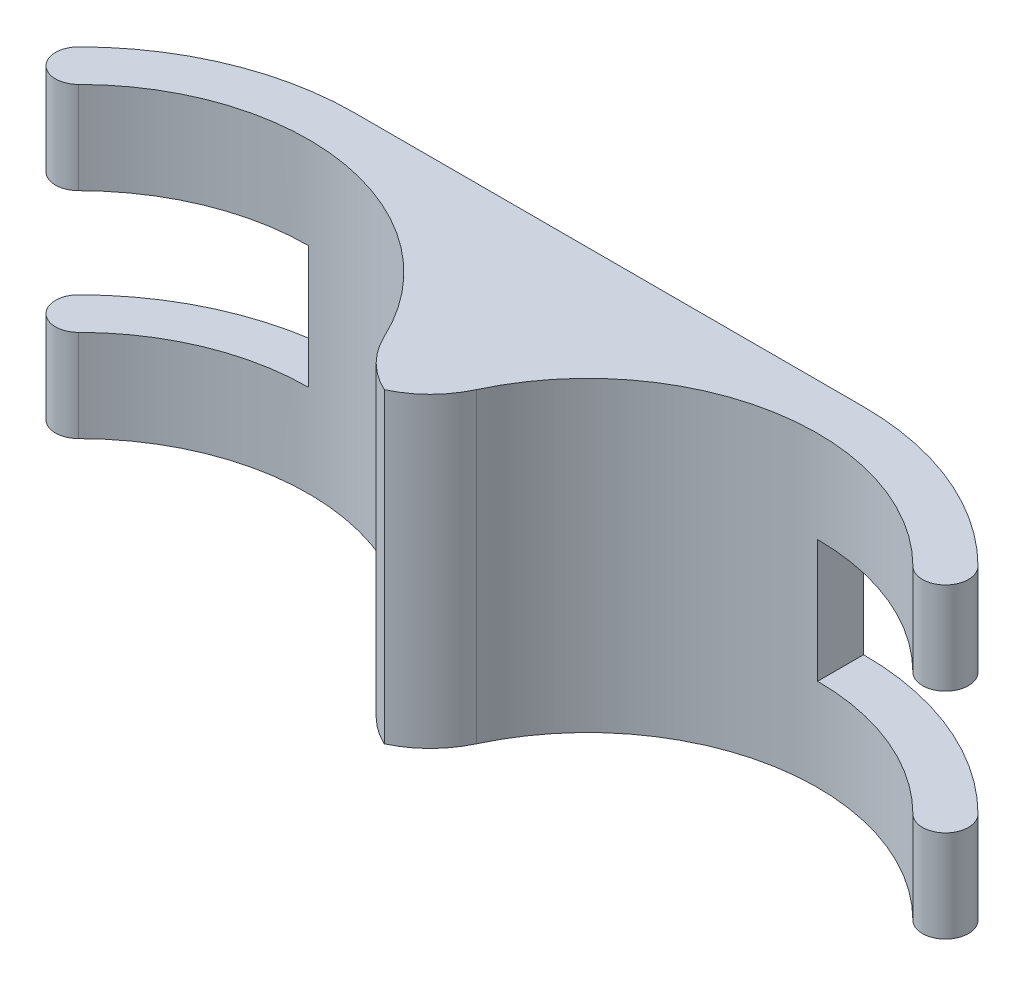
ISO-10303-21;
HEADER;
FILE_DESCRIPTION(('STEP AP214'),'2;1');
FILE_NAME('part.step','',(''),(''),'','','');
FILE_SCHEMA(('AUTOMOTIVE_DESIGN { 1 0 10303 214 1 1 1 1 }'));
ENDSEC;
DATA;
#1=APPLICATION_CONTEXT('core data for automotive mechanical design processes');
#2=APPLICATION_PROTOCOL_DEFINITION('international standard','automotive_design',2000,#1);
#3=PRODUCT_CONTEXT('',#1,'mechanical');
#4=PRODUCT('Part','Part','',(#3));
#5=PRODUCT_RELATED_PRODUCT_CATEGORY('part','',(#4));
#6=PRODUCT_DEFINITION_FORMATION('','',#4);
#7=PRODUCT_DEFINITION_CONTEXT('part definition',#1,'design');
#8=PRODUCT_DEFINITION('design','',#6,#7);
#9=PRODUCT_DEFINITION_SHAPE('','',#8);
#10=(LENGTH_UNIT() NAMED_UNIT(*) SI_UNIT(.MILLI.,.METRE.));
#11=(NAMED_UNIT(*) PLANE_ANGLE_UNIT() SI_UNIT($,.RADIAN.));
#12=(NAMED_UNIT(*) SI_UNIT($,.STERADIAN.) SOLID_ANGLE_UNIT());
#13=UNCERTAINTY_MEASURE_WITH_UNIT(LENGTH_MEASURE(1.E-05),#10,'distance_accuracy_value','');
#14=(GEOMETRIC_REPRESENTATION_CONTEXT(3) GLOBAL_UNCERTAINTY_ASSIGNED_CONTEXT((#13)) GLOBAL_UNIT_ASSIGNED_CONTEXT((#10,
#11,#12)) REPRESENTATION_CONTEXT('',''));
#15=CARTESIAN_POINT('',(0.,0.,0.));
#16=DIRECTION('',(0.,0.,1.));
#17=DIRECTION('',(1.,0.,0.));
#18=AXIS2_PLACEMENT_3D('',#15,#16,#17);
#19=CARTESIAN_POINT('',(5.83363094478903,10.,-5.833630944789));
#20=DIRECTION('',(0.,-1.,0.));
#21=DIRECTION('',(0.,0.,-1.));
#22=AXIS2_PLACEMENT_3D('',#19,#20,#21);
#23=CYLINDRICAL_SURFACE('',#22,0.75);
#24=DIRECTION('',(0.,-1.,0.));
#25=VECTOR('',#24,1.);
#26=CARTESIAN_POINT('',(5.30330085889911,10.,-5.3033008588991));
#27=LINE('',#26,#25);
#28=CARTESIAN_POINT('',(5.30330085889911,10.,-5.3033008588991));
#29=VERTEX_POINT('',#28);
#30=CARTESIAN_POINT('',(5.30330085889911,7.,-5.3033008588991));
#31=VERTEX_POINT('',#30);
#32=EDGE_CURVE('E225',#29,#31,#27,.T.);
#33=ORIENTED_EDGE('',*,*,#32,.T.);
#34=CARTESIAN_POINT('',(5.83363094478903,7.,-5.833630944789));
#35=DIRECTION('',(0.,1.,0.));
#36=DIRECTION('',(0.,0.,1.));
#37=AXIS2_PLACEMENT_3D('',#34,#35,#36);
#38=CIRCLE('',#37,0.75);
#39=CARTESIAN_POINT('',(6.36396103067894,7.,-6.36396103067892));
#40=VERTEX_POINT('',#39);
#41=EDGE_CURVE('E314',#40,#31,#38,.F.);
#42=ORIENTED_EDGE('',*,*,#41,.F.);
#43=DIRECTION('',(0.,-1.,0.));
#44=VECTOR('',#43,1.);
#45=CARTESIAN_POINT('',(6.36396103067894,10.,-6.36396103067892));
#46=LINE('',#45,#44);
#47=CARTESIAN_POINT('',(6.36396103067894,10.,-6.36396103067892));
#48=VERTEX_POINT('',#47);
#49=EDGE_CURVE('E220',#48,#40,#46,.T.);
#50=ORIENTED_EDGE('',*,*,#49,.F.);
#51=CARTESIAN_POINT('',(5.83363094478903,10.,-5.833630944789));
#52=DIRECTION('',(0.,1.,0.));
#53=DIRECTION('',(0.,0.,1.));
#54=AXIS2_PLACEMENT_3D('',#51,#52,#53);
#55=CIRCLE('',#54,0.75);
#56=EDGE_CURVE('E333',#48,#29,#55,.F.);
#57=ORIENTED_EDGE('',*,*,#56,.T.);
#58=EDGE_LOOP('',(#33,#42,#50,#57));
#59=FACE_BOUND('',#58,.T.);
#60=ADVANCED_FACE('F47',(#59),#23,.T.);
#61=CARTESIAN_POINT('',(0.,10.,0.));
#62=DIRECTION('',(0.,-1.,0.));
#63=DIRECTION('',(0.,0.,-1.));
#64=AXIS2_PLACEMENT_3D('',#61,#62,#63);
#65=CYLINDRICAL_SURFACE('',#64,9.);
#66=CARTESIAN_POINT('',(0.,7.,0.));
#67=DIRECTION('',(0.,1.,0.));
#68=DIRECTION('',(0.,0.,1.));
#69=AXIS2_PLACEMENT_3D('',#66,#67,#68);
#70=CIRCLE('',#69,9.);
#71=CARTESIAN_POINT('',(0.,7.,-9.));
#72=VERTEX_POINT('',#71);
#73=EDGE_CURVE('E11',#72,#40,#70,.F.);
#74=ORIENTED_EDGE('',*,*,#73,.F.);
#75=DIRECTION('',(0.,-1.,0.));
#76=VECTOR('',#75,1.);
#77=CARTESIAN_POINT('',(0.,10.,-9.));
#78=LINE('',#77,#76);
#79=CARTESIAN_POINT('',(0.,10.,-9.));
#80=VERTEX_POINT('',#79);
#81=EDGE_CURVE('E216',#80,#72,#78,.T.);
#82=ORIENTED_EDGE('',*,*,#81,.F.);
#83=CARTESIAN_POINT('',(0.,10.,0.));
#84=DIRECTION('',(0.,1.,0.));
#85=DIRECTION('',(0.,0.,1.));
#86=AXIS2_PLACEMENT_3D('',#83,#84,#85);
#87=CIRCLE('',#86,9.);
#88=EDGE_CURVE('E144',#80,#48,#87,.F.);
#89=ORIENTED_EDGE('',*,*,#88,.T.);
#90=ORIENTED_EDGE('',*,*,#49,.T.);
#91=EDGE_LOOP('',(#74,#82,#89,#90));
#92=FACE_BOUND('',#91,.T.);
#93=ADVANCED_FACE('F338',(#92),#65,.T.);
#94=CARTESIAN_POINT('',(-16.5946168055498,10.,0.));
#95=DIRECTION('',(0.,-1.,0.));
#96=DIRECTION('',(0.,0.,-1.));
#97=AXIS2_PLACEMENT_3D('',#94,#95,#96);
#98=CYLINDRICAL_SURFACE('',#97,9.);
#99=DIRECTION('',(0.,-1.,0.));
#100=VECTOR('',#99,1.);
#101=CARTESIAN_POINT('',(-16.5946168055498,10.,-9.));
#102=LINE('',#101,#100);
#103=CARTESIAN_POINT('',(-16.5946168055498,10.,-9.));
#104=VERTEX_POINT('',#103);
#105=CARTESIAN_POINT('',(-16.5946168055498,7.,-9.));
#106=VERTEX_POINT('',#105);
#107=EDGE_CURVE('E151',#104,#106,#102,.T.);
#108=ORIENTED_EDGE('',*,*,#107,.T.);
#109=CARTESIAN_POINT('',(-16.5946168055498,7.,0.));
#110=DIRECTION('',(0.,1.,0.));
#111=DIRECTION('',(-1.,0.,0.));
#112=AXIS2_PLACEMENT_3D('',#109,#110,#111);
#113=CIRCLE('',#112,9.);
#114=CARTESIAN_POINT('',(-22.9585778362287,7.,-6.36396103067892));
#115=VERTEX_POINT('',#114);
#116=EDGE_CURVE('E294',#106,#115,#113,.T.);
#117=ORIENTED_EDGE('',*,*,#116,.T.);
#118=DIRECTION('',(0.,-1.,0.));
#119=VECTOR('',#118,1.);
#120=CARTESIAN_POINT('',(-22.9585778362287,10.,-6.36396103067892));
#121=LINE('',#120,#119);
#122=CARTESIAN_POINT('',(-22.9585778362287,10.,-6.36396103067892));
#123=VERTEX_POINT('',#122);
#124=EDGE_CURVE('E166',#123,#115,#121,.T.);
#125=ORIENTED_EDGE('',*,*,#124,.F.);
#126=CARTESIAN_POINT('',(-16.5946168055498,10.,0.));
#127=DIRECTION('',(0.,1.,0.));
#128=DIRECTION('',(0.,0.,1.));
#129=AXIS2_PLACEMENT_3D('',#126,#127,#128);
#130=CIRCLE('',#129,9.);
#131=EDGE_CURVE('E140',#104,#123,#130,.T.);
#132=ORIENTED_EDGE('',*,*,#131,.F.);
#133=EDGE_LOOP('',(#108,#117,#125,#132));
#134=FACE_BOUND('',#133,.T.);
#135=ADVANCED_FACE('F164',(#134),#98,.T.);
#136=CARTESIAN_POINT('',(-22.4282477503388,10.,-5.833630944789));
#137=DIRECTION('',(0.,-1.,0.));
#138=DIRECTION('',(0.,0.,-1.));
#139=AXIS2_PLACEMENT_3D('',#136,#137,#138);
#140=CYLINDRICAL_SURFACE('',#139,0.749999999999999);
#141=CARTESIAN_POINT('',(-22.4282477503388,7.,-5.833630944789));
#142=DIRECTION('',(0.,1.,0.));
#143=DIRECTION('',(-1.,0.,0.));
#144=AXIS2_PLACEMENT_3D('',#141,#142,#143);
#145=CIRCLE('',#144,0.749999999999999);
#146=CARTESIAN_POINT('',(-21.8979176644489,7.,-5.3033008588991));
#147=VERTEX_POINT('',#146);
#148=EDGE_CURVE('E241',#115,#147,#145,.T.);
#149=ORIENTED_EDGE('',*,*,#148,.T.);
#150=DIRECTION('',(0.,-1.,0.));
#151=VECTOR('',#150,1.);
#152=CARTESIAN_POINT('',(-21.8979176644489,10.,-5.3033008588991));
#153=LINE('',#152,#151);
#154=CARTESIAN_POINT('',(-21.8979176644489,10.,-5.3033008588991));
#155=VERTEX_POINT('',#154);
#156=EDGE_CURVE('E209',#155,#147,#153,.T.);
#157=ORIENTED_EDGE('',*,*,#156,.F.);
#158=CARTESIAN_POINT('',(-22.4282477503388,10.,-5.833630944789));
#159=DIRECTION('',(0.,1.,0.));
#160=DIRECTION('',(0.,0.,1.));
#161=AXIS2_PLACEMENT_3D('',#158,#159,#160);
#162=CIRCLE('',#161,0.749999999999999);
#163=EDGE_CURVE('E72',#123,#155,#162,.T.);
#164=ORIENTED_EDGE('',*,*,#163,.F.);
#165=ORIENTED_EDGE('',*,*,#124,.T.);
#166=EDGE_LOOP('',(#149,#157,#164,#165));
#167=FACE_BOUND('',#166,.T.);
#168=ADVANCED_FACE('F391',(#167),#140,.T.);
#169=CARTESIAN_POINT('',(-16.5946168055498,10.,0.));
#170=DIRECTION('',(0.,-1.,0.));
#171=DIRECTION('',(0.,0.,-1.));
#172=AXIS2_PLACEMENT_3D('',#169,#170,#171);
#173=CYLINDRICAL_SURFACE('',#172,7.5);
#174=CARTESIAN_POINT('',(-16.5946168055498,7.,0.));
#175=DIRECTION('',(0.,1.,0.));
#176=DIRECTION('',(-1.,0.,0.));
#177=AXIS2_PLACEMENT_3D('',#174,#175,#176);
#178=CIRCLE('',#177,7.5);
#179=CARTESIAN_POINT('',(-16.5946168055498,7.,-7.5));
#180=VERTEX_POINT('',#179);
#181=EDGE_CURVE('E297',#180,#147,#178,.T.);
#182=ORIENTED_EDGE('',*,*,#181,.F.);
#183=DIRECTION('',(0.,-1.,0.));
#184=VECTOR('',#183,1.);
#185=CARTESIAN_POINT('',(-16.5946168055498,10.,-7.5));
#186=LINE('',#185,#184);
#187=CARTESIAN_POINT('',(-16.5946168055498,3.,-7.5));
#188=VERTEX_POINT('',#187);
#189=EDGE_CURVE('E301',#188,#180,#186,.F.);
#190=ORIENTED_EDGE('',*,*,#189,.F.);
#191=CARTESIAN_POINT('',(-16.5946168055498,3.,0.));
#192=DIRECTION('',(0.,-1.,0.));
#193=DIRECTION('',(1.,0.,0.));
#194=AXIS2_PLACEMENT_3D('',#191,#192,#193);
#195=CIRCLE('',#194,7.5);
#196=CARTESIAN_POINT('',(-21.8979176644489,3.,-5.3033008588991));
#197=VERTEX_POINT('',#196);
#198=EDGE_CURVE('E290',#197,#188,#195,.T.);
#199=ORIENTED_EDGE('',*,*,#198,.F.);
#200=CARTESIAN_POINT('',(-21.8979176644489,0.,-5.3033008588991));
#201=VERTEX_POINT('',#200);
#202=EDGE_CURVE('E109',#197,#201,#153,.T.);
#203=ORIENTED_EDGE('',*,*,#202,.T.);
#204=CARTESIAN_POINT('',(-16.5946168055498,0.,0.));
#205=DIRECTION('',(0.,1.,0.));
#206=DIRECTION('',(0.,0.,1.));
#207=AXIS2_PLACEMENT_3D('',#204,#205,#206);
#208=CIRCLE('',#207,7.5);
#209=CARTESIAN_POINT('',(-9.79730840277488,0.,-3.16963696305523));
#210=VERTEX_POINT('',#209);
#211=EDGE_CURVE('E173',#210,#201,#208,.T.);
#212=ORIENTED_EDGE('',*,*,#211,.F.);
#213=DIRECTION('',(0.,-1.,0.));
#214=VECTOR('',#213,1.);
#215=CARTESIAN_POINT('',(-9.79730840277488,10.,-3.16963696305523));
#216=LINE('',#215,#214);
#217=CARTESIAN_POINT('',(-9.79730840277488,10.,-3.16963696305523));
#218=VERTEX_POINT('',#217);
#219=EDGE_CURVE('E115',#218,#210,#216,.T.);
#220=ORIENTED_EDGE('',*,*,#219,.F.);
#221=CARTESIAN_POINT('',(-16.5946168055498,10.,0.));
#222=DIRECTION('',(0.,1.,0.));
#223=DIRECTION('',(0.,0.,1.));
#224=AXIS2_PLACEMENT_3D('',#221,#222,#223);
#225=CIRCLE('',#224,7.5);
#226=EDGE_CURVE('E208',#218,#155,#225,.T.);
#227=ORIENTED_EDGE('',*,*,#226,.T.);
#228=ORIENTED_EDGE('',*,*,#156,.T.);
#229=EDGE_LOOP('',(#182,#190,#199,#203,#212,#220,#227,#228));
#230=FACE_BOUND('',#229,.T.);
#231=ADVANCED_FACE('F49',(#230),#173,.F.);
#232=CARTESIAN_POINT('',(-6.98670033818393,10.,-4.48024502764619));
#233=DIRECTION('',(0.,-1.,0.));
#234=DIRECTION('',(0.,0.,-1.));
#235=AXIS2_PLACEMENT_3D('',#232,#233,#234);
#236=CYLINDRICAL_SURFACE('',#235,3.10116287732756);
#237=CARTESIAN_POINT('',(-6.98670033818393,0.,-4.48024502764619));
#238=DIRECTION('',(0.,1.,0.));
#239=DIRECTION('',(0.,0.,1.));
#240=AXIS2_PLACEMENT_3D('',#237,#238,#239);
#241=CIRCLE('',#240,3.10116287732756);
#242=CARTESIAN_POINT('',(-8.29730840277488,0.,-1.66963696305523));
#243=VERTEX_POINT('',#242);
#244=EDGE_CURVE('E177',#210,#243,#241,.T.);
#245=ORIENTED_EDGE('',*,*,#244,.T.);
#246=DIRECTION('',(0.,-1.,0.));
#247=VECTOR('',#246,1.);
#248=CARTESIAN_POINT('',(-8.29730840277488,10.,-1.66963696305523));
#249=LINE('',#248,#247);
#250=CARTESIAN_POINT('',(-8.29730840277488,10.,-1.66963696305523));
#251=VERTEX_POINT('',#250);
#252=EDGE_CURVE('E232',#251,#243,#249,.T.);
#253=ORIENTED_EDGE('',*,*,#252,.F.);
#254=CARTESIAN_POINT('',(-6.98670033818393,10.,-4.48024502764619));
#255=DIRECTION('',(0.,1.,0.));
#256=DIRECTION('',(0.,0.,1.));
#257=AXIS2_PLACEMENT_3D('',#254,#255,#256);
#258=CIRCLE('',#257,3.10116287732756);
#259=EDGE_CURVE('E323',#218,#251,#258,.T.);
#260=ORIENTED_EDGE('',*,*,#259,.F.);
#261=ORIENTED_EDGE('',*,*,#219,.T.);
#262=EDGE_LOOP('',(#245,#253,#260,#261));
#263=FACE_BOUND('',#262,.T.);
#264=ADVANCED_FACE('F390',(#263),#236,.T.);
#265=CARTESIAN_POINT('',(-9.60791646736584,10.,-4.48024502764619));
#266=DIRECTION('',(0.,-1.,0.));
#267=DIRECTION('',(0.,0.,-1.));
#268=AXIS2_PLACEMENT_3D('',#265,#266,#267);
#269=CYLINDRICAL_SURFACE('',#268,3.10116287732756);
#270=CARTESIAN_POINT('',(-9.60791646736584,0.,-4.48024502764619));
#271=DIRECTION('',(0.,1.,0.));
#272=DIRECTION('',(0.,0.,1.));
#273=AXIS2_PLACEMENT_3D('',#270,#271,#272);
#274=CIRCLE('',#273,3.10116287732756);
#275=CARTESIAN_POINT('',(-6.79730840277488,0.,-3.16963696305523));
#276=VERTEX_POINT('',#275);
#277=EDGE_CURVE('E182',#276,#243,#274,.F.);
#278=ORIENTED_EDGE('',*,*,#277,.F.);
#279=DIRECTION('',(0.,-1.,0.));
#280=VECTOR('',#279,1.);
#281=CARTESIAN_POINT('',(-6.79730840277488,10.,-3.16963696305523));
#282=LINE('',#281,#280);
#283=CARTESIAN_POINT('',(-6.79730840277488,10.,-3.16963696305523));
#284=VERTEX_POINT('',#283);
#285=EDGE_CURVE('E229',#284,#276,#282,.T.);
#286=ORIENTED_EDGE('',*,*,#285,.F.);
#287=CARTESIAN_POINT('',(-9.60791646736584,10.,-4.48024502764619));
#288=DIRECTION('',(0.,1.,0.));
#289=DIRECTION('',(0.,0.,1.));
#290=AXIS2_PLACEMENT_3D('',#287,#288,#289);
#291=CIRCLE('',#290,3.10116287732756);
#292=EDGE_CURVE('E326',#284,#251,#291,.F.);
#293=ORIENTED_EDGE('',*,*,#292,.T.);
#294=ORIENTED_EDGE('',*,*,#252,.T.);
#295=EDGE_LOOP('',(#278,#286,#293,#294));
#296=FACE_BOUND('',#295,.T.);
#297=ADVANCED_FACE('F397',(#296),#269,.T.);
#298=CARTESIAN_POINT('',(0.,10.,0.));
#299=DIRECTION('',(0.,-1.,0.));
#300=DIRECTION('',(0.,0.,-1.));
#301=AXIS2_PLACEMENT_3D('',#298,#299,#300);
#302=CYLINDRICAL_SURFACE('',#301,7.5);
#303=DIRECTION('',(0.,-1.,0.));
#304=VECTOR('',#303,1.);
#305=CARTESIAN_POINT('',(0.,10.,-7.5));
#306=LINE('',#305,#304);
#307=CARTESIAN_POINT('',(0.,3.,-7.5));
#308=VERTEX_POINT('',#307);
#309=CARTESIAN_POINT('',(0.,7.,-7.5));
#310=VERTEX_POINT('',#309);
#311=EDGE_CURVE('E305',#308,#310,#306,.F.);
#312=ORIENTED_EDGE('',*,*,#311,.T.);
#313=CARTESIAN_POINT('',(0.,7.,0.));
#314=DIRECTION('',(0.,1.,0.));
#315=DIRECTION('',(0.,0.,1.));
#316=AXIS2_PLACEMENT_3D('',#313,#314,#315);
#317=CIRCLE('',#316,7.5);
#318=EDGE_CURVE('E178',#310,#31,#317,.F.);
#319=ORIENTED_EDGE('',*,*,#318,.T.);
#320=ORIENTED_EDGE('',*,*,#32,.F.);
#321=CARTESIAN_POINT('',(0.,10.,0.));
#322=DIRECTION('',(0.,1.,0.));
#323=DIRECTION('',(0.,0.,1.));
#324=AXIS2_PLACEMENT_3D('',#321,#322,#323);
#325=CIRCLE('',#324,7.5);
#326=EDGE_CURVE('E330',#284,#29,#325,.F.);
#327=ORIENTED_EDGE('',*,*,#326,.F.);
#328=ORIENTED_EDGE('',*,*,#285,.T.);
#329=CARTESIAN_POINT('',(0.,0.,0.));
#330=DIRECTION('',(0.,1.,0.));
#331=DIRECTION('',(0.,0.,1.));
#332=AXIS2_PLACEMENT_3D('',#329,#330,#331);
#333=CIRCLE('',#332,7.5);
#334=CARTESIAN_POINT('',(5.30330085889911,0.,-5.3033008588991));
#335=VERTEX_POINT('',#334);
#336=EDGE_CURVE('E186',#276,#335,#333,.F.);
#337=ORIENTED_EDGE('',*,*,#336,.T.);
#338=CARTESIAN_POINT('',(5.30330085889911,3.,-5.3033008588991));
#339=VERTEX_POINT('',#338);
#340=EDGE_CURVE('E224',#339,#335,#27,.T.);
#341=ORIENTED_EDGE('',*,*,#340,.F.);
#342=CARTESIAN_POINT('',(0.,3.,0.));
#343=DIRECTION('',(0.,-1.,0.));
#344=DIRECTION('',(0.,0.,-1.));
#345=AXIS2_PLACEMENT_3D('',#342,#343,#344);
#346=CIRCLE('',#345,7.5);
#347=EDGE_CURVE('E311',#339,#308,#346,.F.);
#348=ORIENTED_EDGE('',*,*,#347,.T.);
#349=EDGE_LOOP('',(#312,#319,#320,#327,#328,#337,#341,#348));
#350=FACE_BOUND('',#349,.T.);
#351=ADVANCED_FACE('F351',(#350),#302,.F.);
#352=CARTESIAN_POINT('',(5.83363094478903,3.,-5.833630944789));
#353=DIRECTION('',(0.,-1.,0.));
#354=DIRECTION('',(0.,0.,-1.));
#355=AXIS2_PLACEMENT_3D('',#352,#353,#354);
#356=CIRCLE('',#355,0.75);
#357=CARTESIAN_POINT('',(6.36396103067894,3.,-6.36396103067892));
#358=VERTEX_POINT('',#357);
#359=EDGE_CURVE('E255',#339,#358,#356,.F.);
#360=ORIENTED_EDGE('',*,*,#359,.F.);
#361=ORIENTED_EDGE('',*,*,#340,.T.);
#362=CARTESIAN_POINT('',(5.83363094478903,0.,-5.833630944789));
#363=DIRECTION('',(0.,1.,0.));
#364=DIRECTION('',(0.,0.,1.));
#365=AXIS2_PLACEMENT_3D('',#362,#363,#364);
#366=CIRCLE('',#365,0.75);
#367=CARTESIAN_POINT('',(6.36396103067894,0.,-6.36396103067892));
#368=VERTEX_POINT('',#367);
#369=EDGE_CURVE('E190',#368,#335,#366,.F.);
#370=ORIENTED_EDGE('',*,*,#369,.F.);
#371=EDGE_CURVE('E219',#358,#368,#46,.T.);
#372=ORIENTED_EDGE('',*,*,#371,.F.);
#373=EDGE_LOOP('',(#360,#361,#370,#372));
#374=FACE_BOUND('',#373,.T.);
#375=ADVANCED_FACE('F364',(#374),#23,.T.);
#376=CARTESIAN_POINT('',(0.,3.,0.));
#377=DIRECTION('',(0.,-1.,0.));
#378=DIRECTION('',(0.,0.,-1.));
#379=AXIS2_PLACEMENT_3D('',#376,#377,#378);
#380=CIRCLE('',#379,9.);
#381=CARTESIAN_POINT('',(0.,3.,-9.));
#382=VERTEX_POINT('',#381);
#383=EDGE_CURVE('E56',#358,#382,#380,.F.);
#384=ORIENTED_EDGE('',*,*,#383,.F.);
#385=ORIENTED_EDGE('',*,*,#371,.T.);
#386=CARTESIAN_POINT('',(0.,0.,0.));
#387=DIRECTION('',(0.,1.,0.));
#388=DIRECTION('',(0.,0.,1.));
#389=AXIS2_PLACEMENT_3D('',#386,#387,#388);
#390=CIRCLE('',#389,9.);
#391=CARTESIAN_POINT('',(0.,0.,-9.));
#392=VERTEX_POINT('',#391);
#393=EDGE_CURVE('E194',#392,#368,#390,.F.);
#394=ORIENTED_EDGE('',*,*,#393,.F.);
#395=EDGE_CURVE('E161',#382,#392,#78,.T.);
#396=ORIENTED_EDGE('',*,*,#395,.F.);
#397=EDGE_LOOP('',(#384,#385,#394,#396));
#398=FACE_BOUND('',#397,.T.);
#399=ADVANCED_FACE('F260',(#398),#65,.T.);
#400=CARTESIAN_POINT('',(0.,10.,-9.));
#401=DIRECTION('',(0.,0.,1.));
#402=DIRECTION('',(1.,0.,0.));
#403=AXIS2_PLACEMENT_3D('',#400,#401,#402);
#404=PLANE('',#403);
#405=DIRECTION('',(-1.,0.,0.));
#406=VECTOR('',#405,1.);
#407=CARTESIAN_POINT('',(0.,0.,-9.));
#408=LINE('',#407,#406);
#409=CARTESIAN_POINT('',(-16.5946168055498,0.,-9.));
#410=VERTEX_POINT('',#409);
#411=EDGE_CURVE('E198',#392,#410,#408,.T.);
#412=ORIENTED_EDGE('',*,*,#411,.T.);
#413=CARTESIAN_POINT('',(-16.5946168055498,3.,-9.));
#414=VERTEX_POINT('',#413);
#415=EDGE_CURVE('E162',#414,#410,#102,.T.);
#416=ORIENTED_EDGE('',*,*,#415,.F.);
#417=DIRECTION('',(0.,-1.,0.));
#418=VECTOR('',#417,1.);
#419=CARTESIAN_POINT('',(-16.5946168055498,7.,-9.));
#420=LINE('',#419,#418);
#421=EDGE_CURVE('E157',#106,#414,#420,.T.);
#422=ORIENTED_EDGE('',*,*,#421,.F.);
#423=ORIENTED_EDGE('',*,*,#107,.F.);
#424=DIRECTION('',(-1.,0.,0.));
#425=VECTOR('',#424,1.);
#426=CARTESIAN_POINT('',(0.,10.,-9.));
#427=LINE('',#426,#425);
#428=EDGE_CURVE('E136',#80,#104,#427,.T.);
#429=ORIENTED_EDGE('',*,*,#428,.F.);
#430=ORIENTED_EDGE('',*,*,#81,.T.);
#431=DIRECTION('',(0.,1.,0.));
#432=VECTOR('',#431,1.);
#433=CARTESIAN_POINT('',(0.,7.,-9.));
#434=LINE('',#433,#432);
#435=EDGE_CURVE('E263',#382,#72,#434,.T.);
#436=ORIENTED_EDGE('',*,*,#435,.F.);
#437=ORIENTED_EDGE('',*,*,#395,.T.);
#438=EDGE_LOOP('',(#412,#416,#422,#423,#429,#430,#436,#437));
#439=FACE_BOUND('',#438,.T.);
#440=ADVANCED_FACE('F153',(#439),#404,.F.);
#441=CARTESIAN_POINT('',(-22.9585778362287,3.,-6.36396103067892));
#442=VERTEX_POINT('',#441);
#443=CARTESIAN_POINT('',(-22.9585778362287,0.,-6.36396103067892));
#444=VERTEX_POINT('',#443);
#445=EDGE_CURVE('E213',#442,#444,#121,.T.);
#446=ORIENTED_EDGE('',*,*,#445,.F.);
#447=CARTESIAN_POINT('',(-16.5946168055498,3.,0.));
#448=DIRECTION('',(0.,-1.,0.));
#449=DIRECTION('',(1.,0.,0.));
#450=AXIS2_PLACEMENT_3D('',#447,#448,#449);
#451=CIRCLE('',#450,9.);
#452=EDGE_CURVE('E278',#442,#414,#451,.T.);
#453=ORIENTED_EDGE('',*,*,#452,.T.);
#454=ORIENTED_EDGE('',*,*,#415,.T.);
#455=CARTESIAN_POINT('',(-16.5946168055498,0.,0.));
#456=DIRECTION('',(0.,1.,0.));
#457=DIRECTION('',(0.,0.,1.));
#458=AXIS2_PLACEMENT_3D('',#455,#456,#457);
#459=CIRCLE('',#458,9.);
#460=EDGE_CURVE('E201',#410,#444,#459,.T.);
#461=ORIENTED_EDGE('',*,*,#460,.T.);
#462=EDGE_LOOP('',(#446,#453,#454,#461));
#463=FACE_BOUND('',#462,.T.);
#464=ADVANCED_FACE('F382',(#463),#98,.T.);
#465=CARTESIAN_POINT('',(-22.4282477503388,3.,-5.833630944789));
#466=DIRECTION('',(0.,-1.,0.));
#467=DIRECTION('',(1.,0.,0.));
#468=AXIS2_PLACEMENT_3D('',#465,#466,#467);
#469=CIRCLE('',#468,0.749999999999999);
#470=EDGE_CURVE('E237',#197,#442,#469,.T.);
#471=ORIENTED_EDGE('',*,*,#470,.T.);
#472=ORIENTED_EDGE('',*,*,#445,.T.);
#473=CARTESIAN_POINT('',(-22.4282477503388,0.,-5.833630944789));
#474=DIRECTION('',(0.,1.,0.));
#475=DIRECTION('',(0.,0.,1.));
#476=AXIS2_PLACEMENT_3D('',#473,#474,#475);
#477=CIRCLE('',#476,0.749999999999999);
#478=EDGE_CURVE('E205',#444,#201,#477,.T.);
#479=ORIENTED_EDGE('',*,*,#478,.T.);
#480=ORIENTED_EDGE('',*,*,#202,.F.);
#481=EDGE_LOOP('',(#471,#472,#479,#480));
#482=FACE_BOUND('',#481,.T.);
#483=ADVANCED_FACE('F375',(#482),#140,.T.);
#484=CARTESIAN_POINT('',(0.,10.,0.));
#485=DIRECTION('',(0.,1.,0.));
#486=DIRECTION('',(0.,0.,1.));
#487=AXIS2_PLACEMENT_3D('',#484,#485,#486);
#488=PLANE('',#487);
#489=ORIENTED_EDGE('',*,*,#226,.F.);
#490=ORIENTED_EDGE('',*,*,#259,.T.);
#491=ORIENTED_EDGE('',*,*,#292,.F.);
#492=ORIENTED_EDGE('',*,*,#326,.T.);
#493=ORIENTED_EDGE('',*,*,#56,.F.);
#494=ORIENTED_EDGE('',*,*,#88,.F.);
#495=ORIENTED_EDGE('',*,*,#428,.T.);
#496=ORIENTED_EDGE('',*,*,#131,.T.);
#497=ORIENTED_EDGE('',*,*,#163,.T.);
#498=EDGE_LOOP('',(#489,#490,#491,#492,#493,#494,#495,#496,#497));
#499=FACE_BOUND('',#498,.T.);
#500=ADVANCED_FACE('F138',(#499),#488,.T.);
#501=CARTESIAN_POINT('',(0.,0.,0.));
#502=DIRECTION('',(0.,1.,0.));
#503=DIRECTION('',(0.,0.,1.));
#504=AXIS2_PLACEMENT_3D('',#501,#502,#503);
#505=PLANE('',#504);
#506=ORIENTED_EDGE('',*,*,#211,.T.);
#507=ORIENTED_EDGE('',*,*,#478,.F.);
#508=ORIENTED_EDGE('',*,*,#460,.F.);
#509=ORIENTED_EDGE('',*,*,#411,.F.);
#510=ORIENTED_EDGE('',*,*,#393,.T.);
#511=ORIENTED_EDGE('',*,*,#369,.T.);
#512=ORIENTED_EDGE('',*,*,#336,.F.);
#513=ORIENTED_EDGE('',*,*,#277,.T.);
#514=ORIENTED_EDGE('',*,*,#244,.F.);
#515=EDGE_LOOP('',(#506,#507,#508,#509,#510,#511,#512,#513,#514));
#516=FACE_BOUND('',#515,.T.);
#517=ADVANCED_FACE('F384',(#516),#505,.F.);
#518=CARTESIAN_POINT('',(-23.1782477503388,7.,11.));
#519=DIRECTION('',(0.,1.,0.));
#520=DIRECTION('',(-1.,0.,0.));
#521=AXIS2_PLACEMENT_3D('',#518,#519,#520);
#522=PLANE('',#521);
#523=ORIENTED_EDGE('',*,*,#181,.T.);
#524=ORIENTED_EDGE('',*,*,#148,.F.);
#525=ORIENTED_EDGE('',*,*,#116,.F.);
#526=DIRECTION('',(0.,0.,-1.));
#527=VECTOR('',#526,1.);
#528=CARTESIAN_POINT('',(-16.5946168055498,7.,11.));
#529=LINE('',#528,#527);
#530=EDGE_CURVE('E273',#180,#106,#529,.T.);
#531=ORIENTED_EDGE('',*,*,#530,.F.);
#532=EDGE_LOOP('',(#523,#524,#525,#531));
#533=FACE_BOUND('',#532,.T.);
#534=ADVANCED_FACE('F436',(#533),#522,.F.);
#535=CARTESIAN_POINT('',(-23.1782477503388,3.,11.));
#536=DIRECTION('',(0.,-1.,0.));
#537=DIRECTION('',(1.,0.,0.));
#538=AXIS2_PLACEMENT_3D('',#535,#536,#537);
#539=PLANE('',#538);
#540=ORIENTED_EDGE('',*,*,#198,.T.);
#541=DIRECTION('',(0.,0.,-1.));
#542=VECTOR('',#541,1.);
#543=CARTESIAN_POINT('',(-16.5946168055498,3.,11.));
#544=LINE('',#543,#542);
#545=EDGE_CURVE('E283',#188,#414,#544,.T.);
#546=ORIENTED_EDGE('',*,*,#545,.T.);
#547=ORIENTED_EDGE('',*,*,#452,.F.);
#548=ORIENTED_EDGE('',*,*,#470,.F.);
#549=EDGE_LOOP('',(#540,#546,#547,#548));
#550=FACE_BOUND('',#549,.T.);
#551=ADVANCED_FACE('F440',(#550),#539,.F.);
#552=CARTESIAN_POINT('',(-16.5946168055498,7.,11.));
#553=DIRECTION('',(1.,0.,0.));
#554=DIRECTION('',(0.,0.,-1.));
#555=AXIS2_PLACEMENT_3D('',#552,#553,#554);
#556=PLANE('',#555);
#557=ORIENTED_EDGE('',*,*,#189,.T.);
#558=ORIENTED_EDGE('',*,*,#530,.T.);
#559=ORIENTED_EDGE('',*,*,#421,.T.);
#560=ORIENTED_EDGE('',*,*,#545,.F.);
#561=EDGE_LOOP('',(#557,#558,#559,#560));
#562=FACE_BOUND('',#561,.T.);
#563=ADVANCED_FACE('F439',(#562),#556,.F.);
#564=CARTESIAN_POINT('',(6.58363094478903,7.,11.));
#565=DIRECTION('',(0.,1.,0.));
#566=DIRECTION('',(0.,0.,1.));
#567=AXIS2_PLACEMENT_3D('',#564,#565,#566);
#568=PLANE('',#567);
#569=DIRECTION('',(0.,0.,-1.));
#570=VECTOR('',#569,1.);
#571=CARTESIAN_POINT('',(0.,7.,11.));
#572=LINE('',#571,#570);
#573=EDGE_CURVE('E271',#310,#72,#572,.T.);
#574=ORIENTED_EDGE('',*,*,#573,.T.);
#575=ORIENTED_EDGE('',*,*,#73,.T.);
#576=ORIENTED_EDGE('',*,*,#41,.T.);
#577=ORIENTED_EDGE('',*,*,#318,.F.);
#578=EDGE_LOOP('',(#574,#575,#576,#577));
#579=FACE_BOUND('',#578,.T.);
#580=ADVANCED_FACE('F344',(#579),#568,.F.);
#581=CARTESIAN_POINT('',(6.58363094478903,3.,11.));
#582=DIRECTION('',(0.,-1.,0.));
#583=DIRECTION('',(0.,0.,-1.));
#584=AXIS2_PLACEMENT_3D('',#581,#582,#583);
#585=PLANE('',#584);
#586=ORIENTED_EDGE('',*,*,#347,.F.);
#587=ORIENTED_EDGE('',*,*,#359,.T.);
#588=ORIENTED_EDGE('',*,*,#383,.T.);
#589=DIRECTION('',(0.,0.,-1.));
#590=VECTOR('',#589,1.);
#591=CARTESIAN_POINT('',(0.,3.,11.));
#592=LINE('',#591,#590);
#593=EDGE_CURVE('E63',#308,#382,#592,.T.);
#594=ORIENTED_EDGE('',*,*,#593,.F.);
#595=EDGE_LOOP('',(#586,#587,#588,#594));
#596=FACE_BOUND('',#595,.T.);
#597=ADVANCED_FACE('F250',(#596),#585,.F.);
#598=CARTESIAN_POINT('',(0.,7.,11.));
#599=DIRECTION('',(-1.,0.,0.));
#600=DIRECTION('',(0.,-1.,0.));
#601=AXIS2_PLACEMENT_3D('',#598,#599,#600);
#602=PLANE('',#601);
#603=ORIENTED_EDGE('',*,*,#593,.T.);
#604=ORIENTED_EDGE('',*,*,#435,.T.);
#605=ORIENTED_EDGE('',*,*,#573,.F.);
#606=ORIENTED_EDGE('',*,*,#311,.F.);
#607=EDGE_LOOP('',(#603,#604,#605,#606));
#608=FACE_BOUND('',#607,.T.);
#609=ADVANCED_FACE('F355',(#608),#602,.F.);
#610=CLOSED_SHELL('',(#60,#93,#135,#168,#231,#264,#297,#351,#375,#399,#440,#464,#483,#500,#517,
#534,#551,#563,#580,#597,#609));
#611=MANIFOLD_SOLID_BREP('B2',#610);
#612=ADVANCED_BREP_SHAPE_REPRESENTATION('',(#18,#611),#14);
#613=SHAPE_DEFINITION_REPRESENTATION(#9,#612);
ENDSEC;
END-ISO-10303-21;
